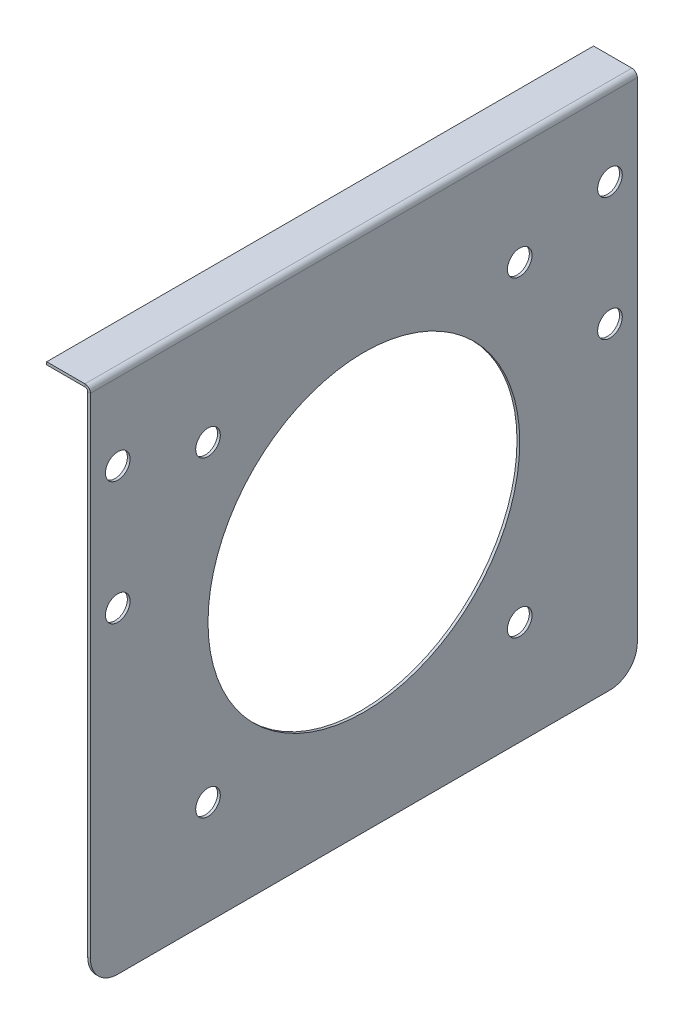
ISO-10303-21;
HEADER;
FILE_DESCRIPTION(('STEP AP214'),'2;1');
FILE_NAME('part.step','',(''),(''),'','','');
FILE_SCHEMA(('AUTOMOTIVE_DESIGN { 1 0 10303 214 1 1 1 1 }'));
ENDSEC;
DATA;
#1=APPLICATION_CONTEXT('core data for automotive mechanical design processes');
#2=APPLICATION_PROTOCOL_DEFINITION('international standard','automotive_design',2000,#1);
#3=PRODUCT_CONTEXT('',#1,'mechanical');
#4=PRODUCT('Part','Part','',(#3));
#5=PRODUCT_RELATED_PRODUCT_CATEGORY('part','',(#4));
#6=PRODUCT_DEFINITION_FORMATION('','',#4);
#7=PRODUCT_DEFINITION_CONTEXT('part definition',#1,'design');
#8=PRODUCT_DEFINITION('design','',#6,#7);
#9=PRODUCT_DEFINITION_SHAPE('','',#8);
#10=(LENGTH_UNIT() NAMED_UNIT(*) SI_UNIT(.MILLI.,.METRE.));
#11=(NAMED_UNIT(*) PLANE_ANGLE_UNIT() SI_UNIT($,.RADIAN.));
#12=(NAMED_UNIT(*) SI_UNIT($,.STERADIAN.) SOLID_ANGLE_UNIT());
#13=UNCERTAINTY_MEASURE_WITH_UNIT(LENGTH_MEASURE(1.E-05),#10,'distance_accuracy_value','');
#14=(GEOMETRIC_REPRESENTATION_CONTEXT(3) GLOBAL_UNCERTAINTY_ASSIGNED_CONTEXT((#13)) GLOBAL_UNIT_ASSIGNED_CONTEXT((#10,
#11,#12)) REPRESENTATION_CONTEXT('',''));
#15=CARTESIAN_POINT('',(0.,0.,0.));
#16=DIRECTION('',(0.,0.,1.));
#17=DIRECTION('',(1.,0.,0.));
#18=AXIS2_PLACEMENT_3D('',#15,#16,#17);
#19=CARTESIAN_POINT('',(0.,-399.978802432248,100.));
#20=DIRECTION('',(-1.,0.,0.));
#21=DIRECTION('',(0.,-1.,0.));
#22=AXIS2_PLACEMENT_3D('',#19,#20,#21);
#23=PLANE('',#22);
#24=DIRECTION('',(0.,0.,1.));
#25=VECTOR('',#24,1.);
#26=CARTESIAN_POINT('',(0.,1.,-90.0000000000001));
#27=LINE('',#26,#25);
#28=CARTESIAN_POINT('',(0.,0.999999999999997,-100.));
#29=VERTEX_POINT('',#28);
#30=CARTESIAN_POINT('',(0.,1.00000000000001,100.));
#31=VERTEX_POINT('',#30);
#32=EDGE_CURVE('E158',#29,#31,#27,.T.);
#33=ORIENTED_EDGE('',*,*,#32,.F.);
#34=DIRECTION('',(0.,1.,0.));
#35=VECTOR('',#34,1.);
#36=CARTESIAN_POINT('',(0.,-399.978802432248,-100.));
#37=LINE('',#36,#35);
#38=CARTESIAN_POINT('',(0.,0.,-100.));
#39=VERTEX_POINT('',#38);
#40=EDGE_CURVE('E48',#39,#29,#37,.T.);
#41=ORIENTED_EDGE('',*,*,#40,.F.);
#42=DIRECTION('',(0.,0.,1.));
#43=VECTOR('',#42,1.);
#44=CARTESIAN_POINT('',(0.,0.,100.));
#45=LINE('',#44,#43);
#46=CARTESIAN_POINT('',(0.,0.,100.));
#47=VERTEX_POINT('',#46);
#48=EDGE_CURVE('E56',#39,#47,#45,.T.);
#49=ORIENTED_EDGE('',*,*,#48,.T.);
#50=DIRECTION('',(0.,1.,0.));
#51=VECTOR('',#50,1.);
#52=CARTESIAN_POINT('',(0.,-399.978802432248,100.));
#53=LINE('',#52,#51);
#54=EDGE_CURVE('E153',#47,#31,#53,.T.);
#55=ORIENTED_EDGE('',*,*,#54,.T.);
#56=EDGE_LOOP('',(#33,#41,#49,#55));
#57=FACE_BOUND('',#56,.T.);
#58=ADVANCED_FACE('F38',(#57),#23,.T.);
#59=CARTESIAN_POINT('',(15.,-399.978802432248,100.));
#60=DIRECTION('',(0.,0.,-1.));
#61=DIRECTION('',(0.,-1.,0.));
#62=AXIS2_PLACEMENT_3D('',#59,#60,#61);
#63=PLANE('',#62);
#64=DIRECTION('',(0.,1.,0.));
#65=VECTOR('',#64,1.);
#66=CARTESIAN_POINT('',(14.,-399.978802432248,100.));
#67=LINE('',#66,#65);
#68=CARTESIAN_POINT('',(14.,0.,100.));
#69=VERTEX_POINT('',#68);
#70=CARTESIAN_POINT('',(14.,1.,100.));
#71=VERTEX_POINT('',#70);
#72=EDGE_CURVE('E145',#69,#71,#67,.T.);
#73=ORIENTED_EDGE('',*,*,#72,.T.);
#74=DIRECTION('',(-1.,0.,0.));
#75=VECTOR('',#74,1.);
#76=CARTESIAN_POINT('',(15.,1.,100.));
#77=LINE('',#76,#75);
#78=EDGE_CURVE('E78',#71,#31,#77,.T.);
#79=ORIENTED_EDGE('',*,*,#78,.T.);
#80=ORIENTED_EDGE('',*,*,#54,.F.);
#81=DIRECTION('',(-1.,0.,0.));
#82=VECTOR('',#81,1.);
#83=CARTESIAN_POINT('',(15.,0.,100.));
#84=LINE('',#83,#82);
#85=EDGE_CURVE('E11',#69,#47,#84,.T.);
#86=ORIENTED_EDGE('',*,*,#85,.F.);
#87=EDGE_LOOP('',(#73,#79,#80,#86));
#88=FACE_BOUND('',#87,.T.);
#89=ADVANCED_FACE('F152',(#88),#63,.F.);
#90=CARTESIAN_POINT('',(15.,1.,100.));
#91=DIRECTION('',(0.,-1.,0.));
#92=DIRECTION('',(0.,0.,-1.));
#93=AXIS2_PLACEMENT_3D('',#90,#91,#92);
#94=PLANE('',#93);
#95=ORIENTED_EDGE('',*,*,#78,.F.);
#96=DIRECTION('',(0.,0.,-1.));
#97=VECTOR('',#96,1.);
#98=CARTESIAN_POINT('',(14.,1.00000000000001,100.));
#99=LINE('',#98,#97);
#100=CARTESIAN_POINT('',(14.,1.,-100.));
#101=VERTEX_POINT('',#100);
#102=EDGE_CURVE('E133',#71,#101,#99,.T.);
#103=ORIENTED_EDGE('',*,*,#102,.T.);
#104=DIRECTION('',(-1.,0.,0.));
#105=VECTOR('',#104,1.);
#106=CARTESIAN_POINT('',(15.,1.00000000000001,-100.));
#107=LINE('',#106,#105);
#108=EDGE_CURVE('E141',#101,#29,#107,.T.);
#109=ORIENTED_EDGE('',*,*,#108,.T.);
#110=ORIENTED_EDGE('',*,*,#32,.T.);
#111=EDGE_LOOP('',(#95,#103,#109,#110));
#112=FACE_BOUND('',#111,.T.);
#113=ADVANCED_FACE('F156',(#112),#94,.F.);
#114=CARTESIAN_POINT('',(15.,-399.978802432248,-100.));
#115=DIRECTION('',(0.,0.,-1.));
#116=DIRECTION('',(0.,-1.,0.));
#117=AXIS2_PLACEMENT_3D('',#114,#115,#116);
#118=PLANE('',#117);
#119=ORIENTED_EDGE('',*,*,#108,.F.);
#120=DIRECTION('',(0.,1.,0.));
#121=VECTOR('',#120,1.);
#122=CARTESIAN_POINT('',(14.,-399.978802432248,-100.));
#123=LINE('',#122,#121);
#124=CARTESIAN_POINT('',(14.,0.,-100.));
#125=VERTEX_POINT('',#124);
#126=EDGE_CURVE('E164',#125,#101,#123,.T.);
#127=ORIENTED_EDGE('',*,*,#126,.F.);
#128=DIRECTION('',(-1.,0.,0.));
#129=VECTOR('',#128,1.);
#130=CARTESIAN_POINT('',(15.,0.,-100.));
#131=LINE('',#130,#129);
#132=EDGE_CURVE('E176',#125,#39,#131,.T.);
#133=ORIENTED_EDGE('',*,*,#132,.T.);
#134=ORIENTED_EDGE('',*,*,#40,.T.);
#135=EDGE_LOOP('',(#119,#127,#133,#134));
#136=FACE_BOUND('',#135,.T.);
#137=ADVANCED_FACE('F180',(#136),#118,.T.);
#138=CARTESIAN_POINT('',(15.,0.,100.));
#139=DIRECTION('',(0.,-1.,0.));
#140=DIRECTION('',(0.,0.,-1.));
#141=AXIS2_PLACEMENT_3D('',#138,#139,#140);
#142=PLANE('',#141);
#143=DIRECTION('',(0.,0.,-1.));
#144=VECTOR('',#143,1.);
#145=CARTESIAN_POINT('',(14.,0.,100.));
#146=LINE('',#145,#144);
#147=EDGE_CURVE('E165',#69,#125,#146,.T.);
#148=ORIENTED_EDGE('',*,*,#147,.F.);
#149=ORIENTED_EDGE('',*,*,#85,.T.);
#150=ORIENTED_EDGE('',*,*,#48,.F.);
#151=ORIENTED_EDGE('',*,*,#132,.F.);
#152=EDGE_LOOP('',(#148,#149,#150,#151));
#153=FACE_BOUND('',#152,.T.);
#154=ADVANCED_FACE('F40',(#153),#142,.T.);
#155=CARTESIAN_POINT('',(16.,-180.,-90.0000000000001));
#156=DIRECTION('',(-1.,0.,0.));
#157=DIRECTION('',(0.,0.,1.));
#158=AXIS2_PLACEMENT_3D('',#155,#156,#157);
#159=PLANE('',#158);
#160=CARTESIAN_POINT('',(16.,-152.,57.));
#161=DIRECTION('',(-1.,0.,0.));
#162=DIRECTION('',(0.,0.,1.));
#163=AXIS2_PLACEMENT_3D('',#160,#161,#162);
#164=CIRCLE('',#163,4.49999999999999);
#165=CARTESIAN_POINT('',(16.,-152.,61.5));
#166=VERTEX_POINT('',#165);
#167=EDGE_CURVE('E329',#166,#166,#164,.T.);
#168=ORIENTED_EDGE('',*,*,#167,.T.);
#169=EDGE_LOOP('',(#168));
#170=FACE_BOUND('',#169,.T.);
#171=CARTESIAN_POINT('',(16.,-152.,-57.));
#172=DIRECTION('',(-1.,0.,0.));
#173=DIRECTION('',(0.,0.,1.));
#174=AXIS2_PLACEMENT_3D('',#171,#172,#173);
#175=CIRCLE('',#174,4.49999999999999);
#176=CARTESIAN_POINT('',(16.,-152.,-52.5));
#177=VERTEX_POINT('',#176);
#178=EDGE_CURVE('E42',#177,#177,#175,.T.);
#179=ORIENTED_EDGE('',*,*,#178,.T.);
#180=EDGE_LOOP('',(#179));
#181=FACE_BOUND('',#180,.T.);
#182=CARTESIAN_POINT('',(16.,-38.,-57.));
#183=DIRECTION('',(-1.,0.,0.));
#184=DIRECTION('',(0.,0.,1.));
#185=AXIS2_PLACEMENT_3D('',#182,#183,#184);
#186=CIRCLE('',#185,4.49999999999999);
#187=CARTESIAN_POINT('',(16.,-38.,-52.5));
#188=VERTEX_POINT('',#187);
#189=EDGE_CURVE('E320',#188,#188,#186,.T.);
#190=ORIENTED_EDGE('',*,*,#189,.T.);
#191=EDGE_LOOP('',(#190));
#192=FACE_BOUND('',#191,.T.);
#193=CARTESIAN_POINT('',(16.,-38.,57.));
#194=DIRECTION('',(-1.,0.,0.));
#195=DIRECTION('',(0.,0.,1.));
#196=AXIS2_PLACEMENT_3D('',#193,#194,#195);
#197=CIRCLE('',#196,4.49999999999999);
#198=CARTESIAN_POINT('',(16.,-38.,61.5));
#199=VERTEX_POINT('',#198);
#200=EDGE_CURVE('E314',#199,#199,#197,.T.);
#201=ORIENTED_EDGE('',*,*,#200,.T.);
#202=EDGE_LOOP('',(#201));
#203=FACE_BOUND('',#202,.T.);
#204=CARTESIAN_POINT('',(16.,-29.0026078075235,-90.0000000000001));
#205=DIRECTION('',(-1.,0.,0.));
#206=DIRECTION('',(0.,0.,1.));
#207=AXIS2_PLACEMENT_3D('',#204,#205,#206);
#208=CIRCLE('',#207,4.49999999999999);
#209=CARTESIAN_POINT('',(16.,-29.0026078075235,-85.5000000000001));
#210=VERTEX_POINT('',#209);
#211=EDGE_CURVE('E308',#210,#210,#208,.T.);
#212=ORIENTED_EDGE('',*,*,#211,.T.);
#213=EDGE_LOOP('',(#212));
#214=FACE_BOUND('',#213,.T.);
#215=CARTESIAN_POINT('',(16.,-74.0026078075235,-90.0000000000001));
#216=DIRECTION('',(-1.,0.,0.));
#217=DIRECTION('',(0.,0.,1.));
#218=AXIS2_PLACEMENT_3D('',#215,#216,#217);
#219=CIRCLE('',#218,4.49999999999999);
#220=CARTESIAN_POINT('',(16.,-74.0026078075235,-85.5000000000001));
#221=VERTEX_POINT('',#220);
#222=EDGE_CURVE('E302',#221,#221,#219,.T.);
#223=ORIENTED_EDGE('',*,*,#222,.T.);
#224=EDGE_LOOP('',(#223));
#225=FACE_BOUND('',#224,.T.);
#226=CARTESIAN_POINT('',(16.,-29.0026078075235,90.));
#227=DIRECTION('',(-1.,0.,0.));
#228=DIRECTION('',(0.,0.,1.));
#229=AXIS2_PLACEMENT_3D('',#226,#227,#228);
#230=CIRCLE('',#229,4.49999999999999);
#231=CARTESIAN_POINT('',(16.,-29.0026078075235,94.5));
#232=VERTEX_POINT('',#231);
#233=EDGE_CURVE('E296',#232,#232,#230,.T.);
#234=ORIENTED_EDGE('',*,*,#233,.T.);
#235=EDGE_LOOP('',(#234));
#236=FACE_BOUND('',#235,.T.);
#237=CARTESIAN_POINT('',(16.,-74.0026078075235,90.));
#238=DIRECTION('',(-1.,0.,0.));
#239=DIRECTION('',(0.,0.,1.));
#240=AXIS2_PLACEMENT_3D('',#237,#238,#239);
#241=CIRCLE('',#240,4.49999999999999);
#242=CARTESIAN_POINT('',(16.,-74.0026078075235,94.5));
#243=VERTEX_POINT('',#242);
#244=EDGE_CURVE('E289',#243,#243,#241,.T.);
#245=ORIENTED_EDGE('',*,*,#244,.T.);
#246=EDGE_LOOP('',(#245));
#247=FACE_BOUND('',#246,.T.);
#248=CARTESIAN_POINT('',(16.,-95.,0.));
#249=DIRECTION('',(-1.,0.,0.));
#250=DIRECTION('',(0.,0.,1.));
#251=AXIS2_PLACEMENT_3D('',#248,#249,#250);
#252=CIRCLE('',#251,57.);
#253=CARTESIAN_POINT('',(16.,-95.,57.));
#254=VERTEX_POINT('',#253);
#255=EDGE_CURVE('E269',#254,#254,#252,.F.);
#256=ORIENTED_EDGE('',*,*,#255,.F.);
#257=EDGE_LOOP('',(#256));
#258=FACE_BOUND('',#257,.T.);
#259=DIRECTION('',(0.,0.,-1.));
#260=VECTOR('',#259,1.);
#261=CARTESIAN_POINT('',(16.,-1.,100.));
#262=LINE('',#261,#260);
#263=CARTESIAN_POINT('',(16.,-0.999999999999999,100.));
#264=VERTEX_POINT('',#263);
#265=CARTESIAN_POINT('',(16.,-0.999999999999998,-100.));
#266=VERTEX_POINT('',#265);
#267=EDGE_CURVE('E248',#264,#266,#262,.T.);
#268=ORIENTED_EDGE('',*,*,#267,.F.);
#269=DIRECTION('',(0.,-1.,0.));
#270=VECTOR('',#269,1.);
#271=CARTESIAN_POINT('',(16.,-180.,100.));
#272=LINE('',#271,#270);
#273=CARTESIAN_POINT('',(16.,-180.,100.));
#274=VERTEX_POINT('',#273);
#275=EDGE_CURVE('E239',#264,#274,#272,.T.);
#276=ORIENTED_EDGE('',*,*,#275,.T.);
#277=CARTESIAN_POINT('',(16.,-180.,90.0000000000001));
#278=DIRECTION('',(-1.,0.,0.));
#279=DIRECTION('',(0.,0.,1.));
#280=AXIS2_PLACEMENT_3D('',#277,#278,#279);
#281=CIRCLE('',#280,10.);
#282=CARTESIAN_POINT('',(16.,-190.,90.0000000000001));
#283=VERTEX_POINT('',#282);
#284=EDGE_CURVE('E246',#274,#283,#281,.F.);
#285=ORIENTED_EDGE('',*,*,#284,.T.);
#286=DIRECTION('',(0.,0.,-1.));
#287=VECTOR('',#286,1.);
#288=CARTESIAN_POINT('',(16.,-190.,-90.0000000000001));
#289=LINE('',#288,#287);
#290=CARTESIAN_POINT('',(16.,-190.,-90.0000000000001));
#291=VERTEX_POINT('',#290);
#292=EDGE_CURVE('E264',#283,#291,#289,.T.);
#293=ORIENTED_EDGE('',*,*,#292,.T.);
#294=CARTESIAN_POINT('',(16.,-180.,-90.0000000000001));
#295=DIRECTION('',(-1.,0.,0.));
#296=DIRECTION('',(0.,0.,1.));
#297=AXIS2_PLACEMENT_3D('',#294,#295,#296);
#298=CIRCLE('',#297,10.);
#299=CARTESIAN_POINT('',(16.,-180.,-100.));
#300=VERTEX_POINT('',#299);
#301=EDGE_CURVE('E93',#291,#300,#298,.F.);
#302=ORIENTED_EDGE('',*,*,#301,.T.);
#303=DIRECTION('',(0.,1.,0.));
#304=VECTOR('',#303,1.);
#305=CARTESIAN_POINT('',(16.,-180.,-100.));
#306=LINE('',#305,#304);
#307=EDGE_CURVE('E86',#300,#266,#306,.T.);
#308=ORIENTED_EDGE('',*,*,#307,.T.);
#309=EDGE_LOOP('',(#268,#276,#285,#293,#302,#308));
#310=FACE_BOUND('',#309,.T.);
#311=ADVANCED_FACE('F198',(#170,#181,#192,#203,#214,#225,#236,#247,#258,#310),#159,.F.);
#312=CARTESIAN_POINT('',(15.,-180.,-90.0000000000001));
#313=DIRECTION('',(-1.,0.,0.));
#314=DIRECTION('',(0.,0.,1.));
#315=AXIS2_PLACEMENT_3D('',#312,#313,#314);
#316=PLANE('',#315);
#317=CARTESIAN_POINT('',(15.,-152.,57.));
#318=DIRECTION('',(-1.,0.,0.));
#319=DIRECTION('',(0.,0.,1.));
#320=AXIS2_PLACEMENT_3D('',#317,#318,#319);
#321=CIRCLE('',#320,4.49999999999998);
#322=CARTESIAN_POINT('',(15.,-152.,61.5));
#323=VERTEX_POINT('',#322);
#324=EDGE_CURVE('E331',#323,#323,#321,.T.);
#325=ORIENTED_EDGE('',*,*,#324,.F.);
#326=EDGE_LOOP('',(#325));
#327=FACE_BOUND('',#326,.T.);
#328=CARTESIAN_POINT('',(15.,-152.,-57.));
#329=DIRECTION('',(-1.,0.,0.));
#330=DIRECTION('',(0.,0.,1.));
#331=AXIS2_PLACEMENT_3D('',#328,#329,#330);
#332=CIRCLE('',#331,4.49999999999998);
#333=CARTESIAN_POINT('',(15.,-152.,-52.5));
#334=VERTEX_POINT('',#333);
#335=EDGE_CURVE('E326',#334,#334,#332,.T.);
#336=ORIENTED_EDGE('',*,*,#335,.F.);
#337=EDGE_LOOP('',(#336));
#338=FACE_BOUND('',#337,.T.);
#339=CARTESIAN_POINT('',(15.,-38.,-57.));
#340=DIRECTION('',(-1.,0.,0.));
#341=DIRECTION('',(0.,0.,1.));
#342=AXIS2_PLACEMENT_3D('',#339,#340,#341);
#343=CIRCLE('',#342,4.49999999999999);
#344=CARTESIAN_POINT('',(15.,-38.,-52.5));
#345=VERTEX_POINT('',#344);
#346=EDGE_CURVE('E323',#345,#345,#343,.T.);
#347=ORIENTED_EDGE('',*,*,#346,.F.);
#348=EDGE_LOOP('',(#347));
#349=FACE_BOUND('',#348,.T.);
#350=CARTESIAN_POINT('',(15.,-38.,57.));
#351=DIRECTION('',(-1.,0.,0.));
#352=DIRECTION('',(0.,0.,1.));
#353=AXIS2_PLACEMENT_3D('',#350,#351,#352);
#354=CIRCLE('',#353,4.49999999999999);
#355=CARTESIAN_POINT('',(15.,-38.,61.5));
#356=VERTEX_POINT('',#355);
#357=EDGE_CURVE('E317',#356,#356,#354,.T.);
#358=ORIENTED_EDGE('',*,*,#357,.F.);
#359=EDGE_LOOP('',(#358));
#360=FACE_BOUND('',#359,.T.);
#361=CARTESIAN_POINT('',(15.,-29.0026078075235,-90.0000000000001));
#362=DIRECTION('',(-1.,0.,0.));
#363=DIRECTION('',(0.,0.,1.));
#364=AXIS2_PLACEMENT_3D('',#361,#362,#363);
#365=CIRCLE('',#364,4.49999999999999);
#366=CARTESIAN_POINT('',(15.,-29.0026078075235,-85.5000000000001));
#367=VERTEX_POINT('',#366);
#368=EDGE_CURVE('E311',#367,#367,#365,.T.);
#369=ORIENTED_EDGE('',*,*,#368,.F.);
#370=EDGE_LOOP('',(#369));
#371=FACE_BOUND('',#370,.T.);
#372=CARTESIAN_POINT('',(15.,-74.0026078075235,-90.0000000000001));
#373=DIRECTION('',(-1.,0.,0.));
#374=DIRECTION('',(0.,0.,1.));
#375=AXIS2_PLACEMENT_3D('',#372,#373,#374);
#376=CIRCLE('',#375,4.49999999999999);
#377=CARTESIAN_POINT('',(15.,-74.0026078075235,-85.5000000000001));
#378=VERTEX_POINT('',#377);
#379=EDGE_CURVE('E305',#378,#378,#376,.T.);
#380=ORIENTED_EDGE('',*,*,#379,.F.);
#381=EDGE_LOOP('',(#380));
#382=FACE_BOUND('',#381,.T.);
#383=CARTESIAN_POINT('',(15.,-29.0026078075235,90.));
#384=DIRECTION('',(-1.,0.,0.));
#385=DIRECTION('',(0.,0.,1.));
#386=AXIS2_PLACEMENT_3D('',#383,#384,#385);
#387=CIRCLE('',#386,4.49999999999999);
#388=CARTESIAN_POINT('',(15.,-29.0026078075235,94.5));
#389=VERTEX_POINT('',#388);
#390=EDGE_CURVE('E299',#389,#389,#387,.T.);
#391=ORIENTED_EDGE('',*,*,#390,.F.);
#392=EDGE_LOOP('',(#391));
#393=FACE_BOUND('',#392,.T.);
#394=CARTESIAN_POINT('',(15.,-74.0026078075235,90.));
#395=DIRECTION('',(-1.,0.,0.));
#396=DIRECTION('',(0.,0.,1.));
#397=AXIS2_PLACEMENT_3D('',#394,#395,#396);
#398=CIRCLE('',#397,4.49999999999999);
#399=CARTESIAN_POINT('',(15.,-74.0026078075235,94.5));
#400=VERTEX_POINT('',#399);
#401=EDGE_CURVE('E293',#400,#400,#398,.T.);
#402=ORIENTED_EDGE('',*,*,#401,.F.);
#403=EDGE_LOOP('',(#402));
#404=FACE_BOUND('',#403,.T.);
#405=CARTESIAN_POINT('',(15.,-95.,0.));
#406=DIRECTION('',(1.,0.,0.));
#407=DIRECTION('',(0.,0.,-1.));
#408=AXIS2_PLACEMENT_3D('',#405,#406,#407);
#409=CIRCLE('',#408,57.);
#410=CARTESIAN_POINT('',(15.,-95.,-57.));
#411=VERTEX_POINT('',#410);
#412=EDGE_CURVE('E272',#411,#411,#409,.T.);
#413=ORIENTED_EDGE('',*,*,#412,.T.);
#414=EDGE_LOOP('',(#413));
#415=FACE_BOUND('',#414,.T.);
#416=DIRECTION('',(0.,-1.,0.));
#417=VECTOR('',#416,1.);
#418=CARTESIAN_POINT('',(15.,0.,100.));
#419=LINE('',#418,#417);
#420=CARTESIAN_POINT('',(15.,-0.999999999999999,100.));
#421=VERTEX_POINT('',#420);
#422=CARTESIAN_POINT('',(15.,-180.,100.));
#423=VERTEX_POINT('',#422);
#424=EDGE_CURVE('E275',#421,#423,#419,.T.);
#425=ORIENTED_EDGE('',*,*,#424,.F.);
#426=DIRECTION('',(0.,0.,-1.));
#427=VECTOR('',#426,1.);
#428=CARTESIAN_POINT('',(15.,-1.,100.));
#429=LINE('',#428,#427);
#430=CARTESIAN_POINT('',(15.,-0.999999999999998,-100.));
#431=VERTEX_POINT('',#430);
#432=EDGE_CURVE('E249',#421,#431,#429,.T.);
#433=ORIENTED_EDGE('',*,*,#432,.T.);
#434=DIRECTION('',(0.,1.,0.));
#435=VECTOR('',#434,1.);
#436=CARTESIAN_POINT('',(15.,0.,-100.));
#437=LINE('',#436,#435);
#438=CARTESIAN_POINT('',(15.,-180.,-100.));
#439=VERTEX_POINT('',#438);
#440=EDGE_CURVE('E284',#439,#431,#437,.T.);
#441=ORIENTED_EDGE('',*,*,#440,.F.);
#442=CARTESIAN_POINT('',(15.,-180.,-90.0000000000001));
#443=DIRECTION('',(1.,0.,0.));
#444=DIRECTION('',(0.,0.,1.));
#445=AXIS2_PLACEMENT_3D('',#442,#443,#444);
#446=CIRCLE('',#445,10.);
#447=CARTESIAN_POINT('',(15.,-190.,-90.0000000000001));
#448=VERTEX_POINT('',#447);
#449=EDGE_CURVE('E260',#448,#439,#446,.T.);
#450=ORIENTED_EDGE('',*,*,#449,.F.);
#451=DIRECTION('',(0.,0.,-1.));
#452=VECTOR('',#451,1.);
#453=CARTESIAN_POINT('',(15.,-190.,-90.0000000000001));
#454=LINE('',#453,#452);
#455=CARTESIAN_POINT('',(15.,-190.,90.0000000000001));
#456=VERTEX_POINT('',#455);
#457=EDGE_CURVE('E280',#456,#448,#454,.T.);
#458=ORIENTED_EDGE('',*,*,#457,.F.);
#459=CARTESIAN_POINT('',(15.,-180.,90.0000000000001));
#460=DIRECTION('',(1.,0.,0.));
#461=DIRECTION('',(0.,0.,-1.));
#462=AXIS2_PLACEMENT_3D('',#459,#460,#461);
#463=CIRCLE('',#462,10.);
#464=EDGE_CURVE('E277',#423,#456,#463,.T.);
#465=ORIENTED_EDGE('',*,*,#464,.F.);
#466=EDGE_LOOP('',(#425,#433,#441,#450,#458,#465));
#467=FACE_BOUND('',#466,.T.);
#468=ADVANCED_FACE('F203',(#327,#338,#349,#360,#371,#382,#393,#404,#415,#467),#316,.T.);
#469=CARTESIAN_POINT('',(15.,-95.,0.));
#470=DIRECTION('',(-1.,0.,0.));
#471=DIRECTION('',(0.,0.,1.));
#472=AXIS2_PLACEMENT_3D('',#469,#470,#471);
#473=CYLINDRICAL_SURFACE('',#472,57.);
#474=ORIENTED_EDGE('',*,*,#412,.F.);
#475=EDGE_LOOP('',(#474));
#476=FACE_BOUND('',#475,.T.);
#477=ORIENTED_EDGE('',*,*,#255,.T.);
#478=EDGE_LOOP('',(#477));
#479=FACE_BOUND('',#478,.T.);
#480=ADVANCED_FACE('F209',(#476,#479),#473,.F.);
#481=CARTESIAN_POINT('',(-534.348980193477,0.,100.));
#482=DIRECTION('',(0.,0.,1.));
#483=DIRECTION('',(0.,-1.,0.));
#484=AXIS2_PLACEMENT_3D('',#481,#482,#483);
#485=PLANE('',#484);
#486=ORIENTED_EDGE('',*,*,#275,.F.);
#487=DIRECTION('',(1.,0.,0.));
#488=VECTOR('',#487,1.);
#489=CARTESIAN_POINT('',(-534.348980193477,-0.999999999999999,100.));
#490=LINE('',#489,#488);
#491=EDGE_CURVE('E148',#421,#264,#490,.T.);
#492=ORIENTED_EDGE('',*,*,#491,.F.);
#493=ORIENTED_EDGE('',*,*,#424,.T.);
#494=DIRECTION('',(1.,0.,0.));
#495=VECTOR('',#494,1.);
#496=CARTESIAN_POINT('',(-534.348980193477,-180.,100.));
#497=LINE('',#496,#495);
#498=EDGE_CURVE('E243',#423,#274,#497,.T.);
#499=ORIENTED_EDGE('',*,*,#498,.T.);
#500=EDGE_LOOP('',(#486,#492,#493,#499));
#501=FACE_BOUND('',#500,.T.);
#502=ADVANCED_FACE('F190',(#501),#485,.T.);
#503=CARTESIAN_POINT('',(-534.348980193477,0.,-100.));
#504=DIRECTION('',(0.,0.,-1.));
#505=DIRECTION('',(0.,1.,0.));
#506=AXIS2_PLACEMENT_3D('',#503,#504,#505);
#507=PLANE('',#506);
#508=ORIENTED_EDGE('',*,*,#307,.F.);
#509=DIRECTION('',(1.,0.,0.));
#510=VECTOR('',#509,1.);
#511=CARTESIAN_POINT('',(-534.348980193477,-180.,-100.));
#512=LINE('',#511,#510);
#513=EDGE_CURVE('E171',#439,#300,#512,.T.);
#514=ORIENTED_EDGE('',*,*,#513,.F.);
#515=ORIENTED_EDGE('',*,*,#440,.T.);
#516=DIRECTION('',(1.,0.,0.));
#517=VECTOR('',#516,1.);
#518=CARTESIAN_POINT('',(-534.348980193477,-0.999999999999999,-100.));
#519=LINE('',#518,#517);
#520=EDGE_CURVE('E169',#431,#266,#519,.T.);
#521=ORIENTED_EDGE('',*,*,#520,.T.);
#522=EDGE_LOOP('',(#508,#514,#515,#521));
#523=FACE_BOUND('',#522,.T.);
#524=ADVANCED_FACE('F227',(#523),#507,.T.);
#525=CARTESIAN_POINT('',(-534.348980193477,-180.,-90.0000000000001));
#526=DIRECTION('',(1.,0.,0.));
#527=DIRECTION('',(0.,0.,-1.));
#528=AXIS2_PLACEMENT_3D('',#525,#526,#527);
#529=CYLINDRICAL_SURFACE('',#528,10.);
#530=ORIENTED_EDGE('',*,*,#301,.F.);
#531=DIRECTION('',(1.,0.,0.));
#532=VECTOR('',#531,1.);
#533=CARTESIAN_POINT('',(-534.348980193477,-190.,-90.0000000000001));
#534=LINE('',#533,#532);
#535=EDGE_CURVE('E258',#448,#291,#534,.T.);
#536=ORIENTED_EDGE('',*,*,#535,.F.);
#537=ORIENTED_EDGE('',*,*,#449,.T.);
#538=ORIENTED_EDGE('',*,*,#513,.T.);
#539=EDGE_LOOP('',(#530,#536,#537,#538));
#540=FACE_BOUND('',#539,.T.);
#541=ADVANCED_FACE('F224',(#540),#529,.T.);
#542=CARTESIAN_POINT('',(-534.348980193477,-190.,-90.0000000000001));
#543=DIRECTION('',(0.,-1.,0.));
#544=DIRECTION('',(0.,0.,-1.));
#545=AXIS2_PLACEMENT_3D('',#542,#543,#544);
#546=PLANE('',#545);
#547=ORIENTED_EDGE('',*,*,#292,.F.);
#548=DIRECTION('',(1.,0.,0.));
#549=VECTOR('',#548,1.);
#550=CARTESIAN_POINT('',(-534.348980193477,-190.,90.0000000000001));
#551=LINE('',#550,#549);
#552=EDGE_CURVE('E251',#456,#283,#551,.T.);
#553=ORIENTED_EDGE('',*,*,#552,.F.);
#554=ORIENTED_EDGE('',*,*,#457,.T.);
#555=ORIENTED_EDGE('',*,*,#535,.T.);
#556=EDGE_LOOP('',(#547,#553,#554,#555));
#557=FACE_BOUND('',#556,.T.);
#558=ADVANCED_FACE('F220',(#557),#546,.T.);
#559=CARTESIAN_POINT('',(-534.348980193477,-180.,90.0000000000001));
#560=DIRECTION('',(1.,0.,0.));
#561=DIRECTION('',(0.,0.,-1.));
#562=AXIS2_PLACEMENT_3D('',#559,#560,#561);
#563=CYLINDRICAL_SURFACE('',#562,10.);
#564=ORIENTED_EDGE('',*,*,#284,.F.);
#565=ORIENTED_EDGE('',*,*,#498,.F.);
#566=ORIENTED_EDGE('',*,*,#464,.T.);
#567=ORIENTED_EDGE('',*,*,#552,.T.);
#568=EDGE_LOOP('',(#564,#565,#566,#567));
#569=FACE_BOUND('',#568,.T.);
#570=ADVANCED_FACE('F216',(#569),#563,.T.);
#571=CARTESIAN_POINT('',(14.,-1.,-100.));
#572=DIRECTION('',(0.,0.,-1.));
#573=DIRECTION('',(-1.,0.,0.));
#574=AXIS2_PLACEMENT_3D('',#571,#572,#573);
#575=PLANE('',#574);
#576=ORIENTED_EDGE('',*,*,#520,.F.);
#577=CARTESIAN_POINT('',(14.,-1.,-100.));
#578=DIRECTION('',(0.,0.,-1.));
#579=DIRECTION('',(-1.,0.,0.));
#580=AXIS2_PLACEMENT_3D('',#577,#578,#579);
#581=CIRCLE('',#580,0.999999999999999);
#582=EDGE_CURVE('E149',#431,#125,#581,.F.);
#583=ORIENTED_EDGE('',*,*,#582,.T.);
#584=ORIENTED_EDGE('',*,*,#126,.T.);
#585=CARTESIAN_POINT('',(14.,-1.,-100.));
#586=DIRECTION('',(0.,0.,-1.));
#587=DIRECTION('',(-1.,0.,0.));
#588=AXIS2_PLACEMENT_3D('',#585,#586,#587);
#589=CIRCLE('',#588,2.);
#590=EDGE_CURVE('E71',#266,#101,#589,.F.);
#591=ORIENTED_EDGE('',*,*,#590,.F.);
#592=EDGE_LOOP('',(#576,#583,#584,#591));
#593=FACE_BOUND('',#592,.T.);
#594=ADVANCED_FACE('F219',(#593),#575,.T.);
#595=CARTESIAN_POINT('',(14.,-1.,100.));
#596=DIRECTION('',(0.,0.,1.));
#597=DIRECTION('',(1.,0.,0.));
#598=AXIS2_PLACEMENT_3D('',#595,#596,#597);
#599=PLANE('',#598);
#600=ORIENTED_EDGE('',*,*,#72,.F.);
#601=CARTESIAN_POINT('',(14.,-1.,100.));
#602=DIRECTION('',(0.,0.,-1.));
#603=DIRECTION('',(-1.,0.,0.));
#604=AXIS2_PLACEMENT_3D('',#601,#602,#603);
#605=CIRCLE('',#604,0.999999999999999);
#606=EDGE_CURVE('E287',#69,#421,#605,.T.);
#607=ORIENTED_EDGE('',*,*,#606,.T.);
#608=ORIENTED_EDGE('',*,*,#491,.T.);
#609=CARTESIAN_POINT('',(14.,-1.,100.));
#610=DIRECTION('',(0.,0.,-1.));
#611=DIRECTION('',(-1.,0.,0.));
#612=AXIS2_PLACEMENT_3D('',#609,#610,#611);
#613=CIRCLE('',#612,2.);
#614=EDGE_CURVE('E136',#71,#264,#613,.T.);
#615=ORIENTED_EDGE('',*,*,#614,.F.);
#616=EDGE_LOOP('',(#600,#607,#608,#615));
#617=FACE_BOUND('',#616,.T.);
#618=ADVANCED_FACE('F144',(#617),#599,.T.);
#619=CARTESIAN_POINT('',(14.,-1.,386.656879588636));
#620=DIRECTION('',(0.,0.,-1.));
#621=DIRECTION('',(-1.,0.,0.));
#622=AXIS2_PLACEMENT_3D('',#619,#620,#621);
#623=CYLINDRICAL_SURFACE('',#622,2.);
#624=ORIENTED_EDGE('',*,*,#614,.T.);
#625=ORIENTED_EDGE('',*,*,#267,.T.);
#626=ORIENTED_EDGE('',*,*,#590,.T.);
#627=ORIENTED_EDGE('',*,*,#102,.F.);
#628=EDGE_LOOP('',(#624,#625,#626,#627));
#629=FACE_BOUND('',#628,.T.);
#630=ADVANCED_FACE('F135',(#629),#623,.T.);
#631=CARTESIAN_POINT('',(14.,-1.,386.656879588636));
#632=DIRECTION('',(0.,0.,-1.));
#633=DIRECTION('',(-1.,0.,0.));
#634=AXIS2_PLACEMENT_3D('',#631,#632,#633);
#635=CYLINDRICAL_SURFACE('',#634,0.999999999999999);
#636=ORIENTED_EDGE('',*,*,#606,.F.);
#637=ORIENTED_EDGE('',*,*,#147,.T.);
#638=ORIENTED_EDGE('',*,*,#582,.F.);
#639=ORIENTED_EDGE('',*,*,#432,.F.);
#640=EDGE_LOOP('',(#636,#637,#638,#639));
#641=FACE_BOUND('',#640,.T.);
#642=ADVANCED_FACE('F359',(#641),#635,.F.);
#643=CARTESIAN_POINT('',(15.,-74.0026078075235,90.));
#644=DIRECTION('',(-1.,0.,0.));
#645=DIRECTION('',(0.,0.,1.));
#646=AXIS2_PLACEMENT_3D('',#643,#644,#645);
#647=CYLINDRICAL_SURFACE('',#646,4.49999999999999);
#648=ORIENTED_EDGE('',*,*,#244,.F.);
#649=EDGE_LOOP('',(#648));
#650=FACE_BOUND('',#649,.T.);
#651=ORIENTED_EDGE('',*,*,#401,.T.);
#652=EDGE_LOOP('',(#651));
#653=FACE_BOUND('',#652,.T.);
#654=ADVANCED_FACE('F361',(#650,#653),#647,.F.);
#655=CARTESIAN_POINT('',(15.,-29.0026078075235,90.));
#656=DIRECTION('',(-1.,0.,0.));
#657=DIRECTION('',(0.,0.,1.));
#658=AXIS2_PLACEMENT_3D('',#655,#656,#657);
#659=CYLINDRICAL_SURFACE('',#658,4.49999999999999);
#660=ORIENTED_EDGE('',*,*,#233,.F.);
#661=EDGE_LOOP('',(#660));
#662=FACE_BOUND('',#661,.T.);
#663=ORIENTED_EDGE('',*,*,#390,.T.);
#664=EDGE_LOOP('',(#663));
#665=FACE_BOUND('',#664,.T.);
#666=ADVANCED_FACE('F367',(#662,#665),#659,.F.);
#667=CARTESIAN_POINT('',(15.,-74.0026078075235,-90.0000000000001));
#668=DIRECTION('',(-1.,0.,0.));
#669=DIRECTION('',(0.,0.,1.));
#670=AXIS2_PLACEMENT_3D('',#667,#668,#669);
#671=CYLINDRICAL_SURFACE('',#670,4.49999999999999);
#672=ORIENTED_EDGE('',*,*,#222,.F.);
#673=EDGE_LOOP('',(#672));
#674=FACE_BOUND('',#673,.T.);
#675=ORIENTED_EDGE('',*,*,#379,.T.);
#676=EDGE_LOOP('',(#675));
#677=FACE_BOUND('',#676,.T.);
#678=ADVANCED_FACE('F410',(#674,#677),#671,.F.);
#679=CARTESIAN_POINT('',(15.,-29.0026078075235,-90.0000000000001));
#680=DIRECTION('',(-1.,0.,0.));
#681=DIRECTION('',(0.,0.,1.));
#682=AXIS2_PLACEMENT_3D('',#679,#680,#681);
#683=CYLINDRICAL_SURFACE('',#682,4.49999999999999);
#684=ORIENTED_EDGE('',*,*,#211,.F.);
#685=EDGE_LOOP('',(#684));
#686=FACE_BOUND('',#685,.T.);
#687=ORIENTED_EDGE('',*,*,#368,.T.);
#688=EDGE_LOOP('',(#687));
#689=FACE_BOUND('',#688,.T.);
#690=ADVANCED_FACE('F420',(#686,#689),#683,.F.);
#691=CARTESIAN_POINT('',(15.,-38.,57.));
#692=DIRECTION('',(-1.,0.,0.));
#693=DIRECTION('',(0.,0.,1.));
#694=AXIS2_PLACEMENT_3D('',#691,#692,#693);
#695=CYLINDRICAL_SURFACE('',#694,4.49999999999999);
#696=ORIENTED_EDGE('',*,*,#357,.T.);
#697=EDGE_LOOP('',(#696));
#698=FACE_BOUND('',#697,.T.);
#699=ORIENTED_EDGE('',*,*,#200,.F.);
#700=EDGE_LOOP('',(#699));
#701=FACE_BOUND('',#700,.T.);
#702=ADVANCED_FACE('F430',(#698,#701),#695,.F.);
#703=CARTESIAN_POINT('',(15.,-38.,-57.));
#704=DIRECTION('',(-1.,0.,0.));
#705=DIRECTION('',(0.,0.,1.));
#706=AXIS2_PLACEMENT_3D('',#703,#704,#705);
#707=CYLINDRICAL_SURFACE('',#706,4.49999999999999);
#708=ORIENTED_EDGE('',*,*,#346,.T.);
#709=EDGE_LOOP('',(#708));
#710=FACE_BOUND('',#709,.T.);
#711=ORIENTED_EDGE('',*,*,#189,.F.);
#712=EDGE_LOOP('',(#711));
#713=FACE_BOUND('',#712,.T.);
#714=ADVANCED_FACE('F439',(#710,#713),#707,.F.);
#715=CARTESIAN_POINT('',(15.,-152.,-57.));
#716=DIRECTION('',(-1.,0.,0.));
#717=DIRECTION('',(0.,0.,1.));
#718=AXIS2_PLACEMENT_3D('',#715,#716,#717);
#719=CYLINDRICAL_SURFACE('',#718,4.49999999999999);
#720=ORIENTED_EDGE('',*,*,#335,.T.);
#721=EDGE_LOOP('',(#720));
#722=FACE_BOUND('',#721,.T.);
#723=ORIENTED_EDGE('',*,*,#178,.F.);
#724=EDGE_LOOP('',(#723));
#725=FACE_BOUND('',#724,.T.);
#726=ADVANCED_FACE('F448',(#722,#725),#719,.F.);
#727=CARTESIAN_POINT('',(15.,-152.,57.));
#728=DIRECTION('',(-1.,0.,0.));
#729=DIRECTION('',(0.,0.,1.));
#730=AXIS2_PLACEMENT_3D('',#727,#728,#729);
#731=CYLINDRICAL_SURFACE('',#730,4.49999999999999);
#732=ORIENTED_EDGE('',*,*,#324,.T.);
#733=EDGE_LOOP('',(#732));
#734=FACE_BOUND('',#733,.T.);
#735=ORIENTED_EDGE('',*,*,#167,.F.);
#736=EDGE_LOOP('',(#735));
#737=FACE_BOUND('',#736,.T.);
#738=ADVANCED_FACE('F335',(#734,#737),#731,.F.);
#739=CLOSED_SHELL('',(#58,#89,#113,#137,#154,#311,#468,#480,#502,#524,#541,#558,#570,#594,#618,
#630,#642,#654,#666,#678,#690,#702,#714,#726,#738));
#740=MANIFOLD_SOLID_BREP('B2',#739);
#741=ADVANCED_BREP_SHAPE_REPRESENTATION('',(#18,#740),#14);
#742=SHAPE_DEFINITION_REPRESENTATION(#9,#741);
ENDSEC;
END-ISO-10303-21;
